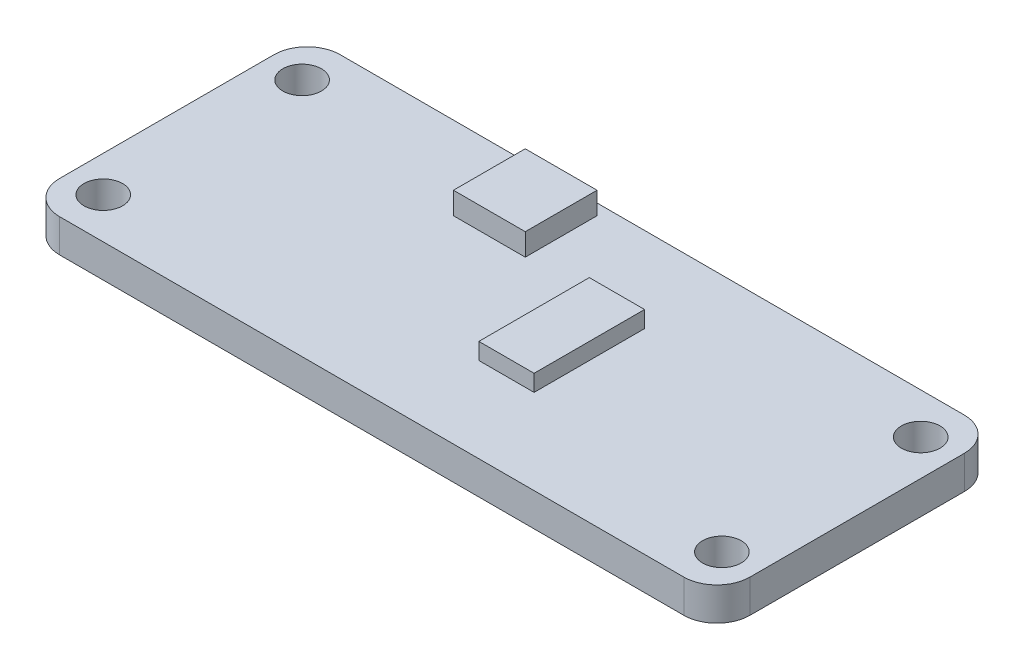
ISO-10303-21;
HEADER;
FILE_DESCRIPTION(('STEP AP214'),'2;1');
FILE_NAME('part.step','',(''),(''),'','','');
FILE_SCHEMA(('AUTOMOTIVE_DESIGN { 1 0 10303 214 1 1 1 1 }'));
ENDSEC;
DATA;
#1=APPLICATION_CONTEXT('core data for automotive mechanical design processes');
#2=APPLICATION_PROTOCOL_DEFINITION('international standard','automotive_design',2000,#1);
#3=PRODUCT_CONTEXT('',#1,'mechanical');
#4=PRODUCT('Part','Part','',(#3));
#5=PRODUCT_RELATED_PRODUCT_CATEGORY('part','',(#4));
#6=PRODUCT_DEFINITION_FORMATION('','',#4);
#7=PRODUCT_DEFINITION_CONTEXT('part definition',#1,'design');
#8=PRODUCT_DEFINITION('design','',#6,#7);
#9=PRODUCT_DEFINITION_SHAPE('','',#8);
#10=(LENGTH_UNIT() NAMED_UNIT(*) SI_UNIT(.MILLI.,.METRE.));
#11=(NAMED_UNIT(*) PLANE_ANGLE_UNIT() SI_UNIT($,.RADIAN.));
#12=(NAMED_UNIT(*) SI_UNIT($,.STERADIAN.) SOLID_ANGLE_UNIT());
#13=UNCERTAINTY_MEASURE_WITH_UNIT(LENGTH_MEASURE(1.E-05),#10,'distance_accuracy_value','');
#14=(GEOMETRIC_REPRESENTATION_CONTEXT(3) GLOBAL_UNCERTAINTY_ASSIGNED_CONTEXT((#13)) GLOBAL_UNIT_ASSIGNED_CONTEXT((#10,
#11,#12)) REPRESENTATION_CONTEXT('',''));
#15=CARTESIAN_POINT('',(0.,0.,0.));
#16=DIRECTION('',(0.,0.,1.));
#17=DIRECTION('',(1.,0.,0.));
#18=AXIS2_PLACEMENT_3D('',#15,#16,#17);
#19=CARTESIAN_POINT('',(0.,3.,0.));
#20=DIRECTION('',(0.,1.,0.));
#21=DIRECTION('',(0.,0.,1.));
#22=AXIS2_PLACEMENT_3D('',#19,#20,#21);
#23=PLANE('',#22);
#24=CARTESIAN_POINT('',(-28.,3.,9.));
#25=DIRECTION('',(0.,1.,0.));
#26=DIRECTION('',(0.,0.,1.));
#27=AXIS2_PLACEMENT_3D('',#24,#25,#26);
#28=CIRCLE('',#27,1.75);
#29=CARTESIAN_POINT('',(-28.,3.,10.75));
#30=VERTEX_POINT('',#29);
#31=EDGE_CURVE('E255',#30,#30,#28,.T.);
#32=ORIENTED_EDGE('',*,*,#31,.F.);
#33=EDGE_LOOP('',(#32));
#34=FACE_BOUND('',#33,.T.);
#35=CARTESIAN_POINT('',(28.,3.,9.));
#36=DIRECTION('',(0.,1.,0.));
#37=DIRECTION('',(0.,0.,1.));
#38=AXIS2_PLACEMENT_3D('',#35,#36,#37);
#39=CIRCLE('',#38,1.75);
#40=CARTESIAN_POINT('',(28.,3.,10.75));
#41=VERTEX_POINT('',#40);
#42=EDGE_CURVE('E247',#41,#41,#39,.T.);
#43=ORIENTED_EDGE('',*,*,#42,.F.);
#44=EDGE_LOOP('',(#43));
#45=FACE_BOUND('',#44,.T.);
#46=CARTESIAN_POINT('',(28.,3.,-9.));
#47=DIRECTION('',(0.,1.,0.));
#48=DIRECTION('',(0.,0.,1.));
#49=AXIS2_PLACEMENT_3D('',#46,#47,#48);
#50=CIRCLE('',#49,1.75);
#51=CARTESIAN_POINT('',(28.,3.,-7.25));
#52=VERTEX_POINT('',#51);
#53=EDGE_CURVE('E238',#52,#52,#50,.T.);
#54=ORIENTED_EDGE('',*,*,#53,.F.);
#55=EDGE_LOOP('',(#54));
#56=FACE_BOUND('',#55,.T.);
#57=CARTESIAN_POINT('',(-28.,3.,-9.));
#58=DIRECTION('',(0.,1.,0.));
#59=DIRECTION('',(0.,0.,1.));
#60=AXIS2_PLACEMENT_3D('',#57,#58,#59);
#61=CIRCLE('',#60,1.75);
#62=CARTESIAN_POINT('',(-28.,3.,-7.25));
#63=VERTEX_POINT('',#62);
#64=EDGE_CURVE('E242',#63,#63,#61,.T.);
#65=ORIENTED_EDGE('',*,*,#64,.F.);
#66=EDGE_LOOP('',(#65));
#67=FACE_BOUND('',#66,.T.);
#68=DIRECTION('',(-1.,0.,0.));
#69=VECTOR('',#68,1.);
#70=CARTESIAN_POINT('',(-31.25,3.,-12.7));
#71=LINE('',#70,#69);
#72=CARTESIAN_POINT('',(28.25,3.,-12.7));
#73=VERTEX_POINT('',#72);
#74=CARTESIAN_POINT('',(-28.25,3.,-12.7));
#75=VERTEX_POINT('',#74);
#76=EDGE_CURVE('E274',#73,#75,#71,.T.);
#77=ORIENTED_EDGE('',*,*,#76,.T.);
#78=CARTESIAN_POINT('',(-28.25,3.,-9.7));
#79=DIRECTION('',(0.,1.,0.));
#80=DIRECTION('',(0.,0.,1.));
#81=AXIS2_PLACEMENT_3D('',#78,#79,#80);
#82=CIRCLE('',#81,3.);
#83=CARTESIAN_POINT('',(-31.25,3.,-9.7));
#84=VERTEX_POINT('',#83);
#85=EDGE_CURVE('E336',#75,#84,#82,.T.);
#86=ORIENTED_EDGE('',*,*,#85,.T.);
#87=DIRECTION('',(0.,0.,1.));
#88=VECTOR('',#87,1.);
#89=CARTESIAN_POINT('',(-31.25,3.,-12.7));
#90=LINE('',#89,#88);
#91=CARTESIAN_POINT('',(-31.25,3.,9.7));
#92=VERTEX_POINT('',#91);
#93=EDGE_CURVE('E279',#84,#92,#90,.T.);
#94=ORIENTED_EDGE('',*,*,#93,.T.);
#95=CARTESIAN_POINT('',(-28.25,3.,9.7));
#96=DIRECTION('',(0.,1.,0.));
#97=DIRECTION('',(0.,0.,1.));
#98=AXIS2_PLACEMENT_3D('',#95,#96,#97);
#99=CIRCLE('',#98,3.);
#100=CARTESIAN_POINT('',(-28.25,3.,12.7));
#101=VERTEX_POINT('',#100);
#102=EDGE_CURVE('E327',#92,#101,#99,.T.);
#103=ORIENTED_EDGE('',*,*,#102,.T.);
#104=DIRECTION('',(1.,0.,0.));
#105=VECTOR('',#104,1.);
#106=CARTESIAN_POINT('',(-31.25,3.,12.7));
#107=LINE('',#106,#105);
#108=CARTESIAN_POINT('',(28.25,3.,12.7));
#109=VERTEX_POINT('',#108);
#110=EDGE_CURVE('E283',#101,#109,#107,.T.);
#111=ORIENTED_EDGE('',*,*,#110,.T.);
#112=CARTESIAN_POINT('',(28.25,3.,9.7));
#113=DIRECTION('',(0.,1.,0.));
#114=DIRECTION('',(0.,0.,1.));
#115=AXIS2_PLACEMENT_3D('',#112,#113,#114);
#116=CIRCLE('',#115,3.);
#117=CARTESIAN_POINT('',(31.25,3.,9.7));
#118=VERTEX_POINT('',#117);
#119=EDGE_CURVE('E330',#109,#118,#116,.T.);
#120=ORIENTED_EDGE('',*,*,#119,.T.);
#121=DIRECTION('',(0.,0.,-1.));
#122=VECTOR('',#121,1.);
#123=CARTESIAN_POINT('',(31.25,3.,-12.7));
#124=LINE('',#123,#122);
#125=CARTESIAN_POINT('',(31.25,3.,-9.7));
#126=VERTEX_POINT('',#125);
#127=EDGE_CURVE('E270',#118,#126,#124,.T.);
#128=ORIENTED_EDGE('',*,*,#127,.T.);
#129=CARTESIAN_POINT('',(28.25,3.,-9.7));
#130=DIRECTION('',(0.,1.,0.));
#131=DIRECTION('',(0.,0.,1.));
#132=AXIS2_PLACEMENT_3D('',#129,#130,#131);
#133=CIRCLE('',#132,3.);
#134=EDGE_CURVE('E333',#126,#73,#133,.T.);
#135=ORIENTED_EDGE('',*,*,#134,.T.);
#136=EDGE_LOOP('',(#77,#86,#94,#103,#111,#120,#128,#135));
#137=FACE_BOUND('',#136,.T.);
#138=DIRECTION('',(-1.,0.,0.));
#139=VECTOR('',#138,1.);
#140=CARTESIAN_POINT('',(-10.5,3.,-11.7));
#141=LINE('',#140,#139);
#142=CARTESIAN_POINT('',(-4.,3.,-11.7));
#143=VERTEX_POINT('',#142);
#144=CARTESIAN_POINT('',(-10.5,3.,-11.7));
#145=VERTEX_POINT('',#144);
#146=EDGE_CURVE('E198',#143,#145,#141,.T.);
#147=ORIENTED_EDGE('',*,*,#146,.F.);
#148=DIRECTION('',(0.,0.,-1.));
#149=VECTOR('',#148,1.);
#150=CARTESIAN_POINT('',(-4.,3.,-11.7));
#151=LINE('',#150,#149);
#152=CARTESIAN_POINT('',(-4.,3.,-5.2));
#153=VERTEX_POINT('',#152);
#154=EDGE_CURVE('E193',#153,#143,#151,.T.);
#155=ORIENTED_EDGE('',*,*,#154,.F.);
#156=DIRECTION('',(1.,0.,0.));
#157=VECTOR('',#156,1.);
#158=CARTESIAN_POINT('',(-10.5,3.,-5.2));
#159=LINE('',#158,#157);
#160=CARTESIAN_POINT('',(-10.5,3.,-5.2));
#161=VERTEX_POINT('',#160);
#162=EDGE_CURVE('E208',#161,#153,#159,.T.);
#163=ORIENTED_EDGE('',*,*,#162,.F.);
#164=DIRECTION('',(0.,0.,1.));
#165=VECTOR('',#164,1.);
#166=CARTESIAN_POINT('',(-10.5,3.,-11.7));
#167=LINE('',#166,#165);
#168=EDGE_CURVE('E220',#145,#161,#167,.T.);
#169=ORIENTED_EDGE('',*,*,#168,.F.);
#170=EDGE_LOOP('',(#147,#155,#163,#169));
#171=FACE_BOUND('',#170,.T.);
#172=DIRECTION('',(-1.,0.,0.));
#173=VECTOR('',#172,1.);
#174=CARTESIAN_POINT('',(2.,3.,-5.));
#175=LINE('',#174,#173);
#176=CARTESIAN_POINT('',(7.,3.,-5.));
#177=VERTEX_POINT('',#176);
#178=CARTESIAN_POINT('',(2.,3.,-5.));
#179=VERTEX_POINT('',#178);
#180=EDGE_CURVE('E653',#177,#179,#175,.T.);
#181=ORIENTED_EDGE('',*,*,#180,.F.);
#182=DIRECTION('',(0.,0.,-1.));
#183=VECTOR('',#182,1.);
#184=CARTESIAN_POINT('',(7.,3.,-5.));
#185=LINE('',#184,#183);
#186=CARTESIAN_POINT('',(7.,3.,5.));
#187=VERTEX_POINT('',#186);
#188=EDGE_CURVE('E190',#187,#177,#185,.T.);
#189=ORIENTED_EDGE('',*,*,#188,.F.);
#190=DIRECTION('',(1.,0.,0.));
#191=VECTOR('',#190,1.);
#192=CARTESIAN_POINT('',(2.,3.,5.));
#193=LINE('',#192,#191);
#194=CARTESIAN_POINT('',(2.,3.,5.));
#195=VERTEX_POINT('',#194);
#196=EDGE_CURVE('E186',#195,#187,#193,.T.);
#197=ORIENTED_EDGE('',*,*,#196,.F.);
#198=DIRECTION('',(0.,0.,1.));
#199=VECTOR('',#198,1.);
#200=CARTESIAN_POINT('',(2.,3.,-5.));
#201=LINE('',#200,#199);
#202=EDGE_CURVE('E649',#179,#195,#201,.T.);
#203=ORIENTED_EDGE('',*,*,#202,.F.);
#204=EDGE_LOOP('',(#181,#189,#197,#203));
#205=FACE_BOUND('',#204,.T.);
#206=ADVANCED_FACE('F51',(#34,#45,#56,#67,#137,#171,#205),#23,.T.);
#207=CARTESIAN_POINT('',(31.25,3.,-12.7));
#208=DIRECTION('',(-1.,0.,0.));
#209=DIRECTION('',(0.,0.,1.));
#210=AXIS2_PLACEMENT_3D('',#207,#208,#209);
#211=PLANE('',#210);
#212=DIRECTION('',(0.,0.,-1.));
#213=VECTOR('',#212,1.);
#214=CARTESIAN_POINT('',(31.25,0.,-12.7));
#215=LINE('',#214,#213);
#216=CARTESIAN_POINT('',(31.25,0.,9.7));
#217=VERTEX_POINT('',#216);
#218=CARTESIAN_POINT('',(31.25,0.,-9.7));
#219=VERTEX_POINT('',#218);
#220=EDGE_CURVE('E266',#217,#219,#215,.T.);
#221=ORIENTED_EDGE('',*,*,#220,.T.);
#222=DIRECTION('',(0.,-1.,0.));
#223=VECTOR('',#222,1.);
#224=CARTESIAN_POINT('',(31.25,3.,-9.7));
#225=LINE('',#224,#223);
#226=EDGE_CURVE('E343',#219,#126,#225,.F.);
#227=ORIENTED_EDGE('',*,*,#226,.T.);
#228=ORIENTED_EDGE('',*,*,#127,.F.);
#229=DIRECTION('',(0.,-1.,0.));
#230=VECTOR('',#229,1.);
#231=CARTESIAN_POINT('',(31.25,3.,9.7));
#232=LINE('',#231,#230);
#233=EDGE_CURVE('E339',#118,#217,#232,.T.);
#234=ORIENTED_EDGE('',*,*,#233,.T.);
#235=EDGE_LOOP('',(#221,#227,#228,#234));
#236=FACE_BOUND('',#235,.T.);
#237=ADVANCED_FACE('F365',(#236),#211,.F.);
#238=CARTESIAN_POINT('',(-31.25,3.,-12.7));
#239=DIRECTION('',(0.,0.,1.));
#240=DIRECTION('',(1.,0.,0.));
#241=AXIS2_PLACEMENT_3D('',#238,#239,#240);
#242=PLANE('',#241);
#243=DIRECTION('',(-1.,0.,0.));
#244=VECTOR('',#243,1.);
#245=CARTESIAN_POINT('',(-31.25,0.,-12.7));
#246=LINE('',#245,#244);
#247=CARTESIAN_POINT('',(28.25,0.,-12.7));
#248=VERTEX_POINT('',#247);
#249=CARTESIAN_POINT('',(-28.25,0.,-12.7));
#250=VERTEX_POINT('',#249);
#251=EDGE_CURVE('E291',#248,#250,#246,.T.);
#252=ORIENTED_EDGE('',*,*,#251,.T.);
#253=DIRECTION('',(0.,-1.,0.));
#254=VECTOR('',#253,1.);
#255=CARTESIAN_POINT('',(-28.25,3.,-12.7));
#256=LINE('',#255,#254);
#257=EDGE_CURVE('E324',#250,#75,#256,.F.);
#258=ORIENTED_EDGE('',*,*,#257,.T.);
#259=ORIENTED_EDGE('',*,*,#76,.F.);
#260=DIRECTION('',(0.,-1.,0.));
#261=VECTOR('',#260,1.);
#262=CARTESIAN_POINT('',(28.25,3.,-12.7));
#263=LINE('',#262,#261);
#264=EDGE_CURVE('E320',#73,#248,#263,.T.);
#265=ORIENTED_EDGE('',*,*,#264,.T.);
#266=EDGE_LOOP('',(#252,#258,#259,#265));
#267=FACE_BOUND('',#266,.T.);
#268=ADVANCED_FACE('F376',(#267),#242,.F.);
#269=CARTESIAN_POINT('',(-31.25,3.,-12.7));
#270=DIRECTION('',(1.,0.,0.));
#271=DIRECTION('',(0.,0.,-1.));
#272=AXIS2_PLACEMENT_3D('',#269,#270,#271);
#273=PLANE('',#272);
#274=ORIENTED_EDGE('',*,*,#93,.F.);
#275=DIRECTION('',(0.,-1.,0.));
#276=VECTOR('',#275,1.);
#277=CARTESIAN_POINT('',(-31.25,3.,-9.7));
#278=LINE('',#277,#276);
#279=CARTESIAN_POINT('',(-31.25,0.,-9.7));
#280=VERTEX_POINT('',#279);
#281=EDGE_CURVE('E304',#84,#280,#278,.T.);
#282=ORIENTED_EDGE('',*,*,#281,.T.);
#283=DIRECTION('',(0.,0.,1.));
#284=VECTOR('',#283,1.);
#285=CARTESIAN_POINT('',(-31.25,0.,-12.7));
#286=LINE('',#285,#284);
#287=CARTESIAN_POINT('',(-31.25,0.,9.7));
#288=VERTEX_POINT('',#287);
#289=EDGE_CURVE('E295',#280,#288,#286,.T.);
#290=ORIENTED_EDGE('',*,*,#289,.T.);
#291=DIRECTION('',(0.,-1.,0.));
#292=VECTOR('',#291,1.);
#293=CARTESIAN_POINT('',(-31.25,3.,9.7));
#294=LINE('',#293,#292);
#295=EDGE_CURVE('E287',#288,#92,#294,.F.);
#296=ORIENTED_EDGE('',*,*,#295,.T.);
#297=EDGE_LOOP('',(#274,#282,#290,#296));
#298=FACE_BOUND('',#297,.T.);
#299=ADVANCED_FACE('F384',(#298),#273,.F.);
#300=CARTESIAN_POINT('',(-31.25,3.,12.7));
#301=DIRECTION('',(0.,0.,-1.));
#302=DIRECTION('',(-1.,0.,0.));
#303=AXIS2_PLACEMENT_3D('',#300,#301,#302);
#304=PLANE('',#303);
#305=DIRECTION('',(1.,0.,0.));
#306=VECTOR('',#305,1.);
#307=CARTESIAN_POINT('',(-31.25,0.,12.7));
#308=LINE('',#307,#306);
#309=CARTESIAN_POINT('',(-28.25,0.,12.7));
#310=VERTEX_POINT('',#309);
#311=CARTESIAN_POINT('',(28.25,0.,12.7));
#312=VERTEX_POINT('',#311);
#313=EDGE_CURVE('E275',#310,#312,#308,.T.);
#314=ORIENTED_EDGE('',*,*,#313,.T.);
#315=DIRECTION('',(0.,-1.,0.));
#316=VECTOR('',#315,1.);
#317=CARTESIAN_POINT('',(28.25,3.,12.7));
#318=LINE('',#317,#316);
#319=EDGE_CURVE('E11',#312,#109,#318,.F.);
#320=ORIENTED_EDGE('',*,*,#319,.T.);
#321=ORIENTED_EDGE('',*,*,#110,.F.);
#322=DIRECTION('',(0.,-1.,0.));
#323=VECTOR('',#322,1.);
#324=CARTESIAN_POINT('',(-28.25,3.,12.7));
#325=LINE('',#324,#323);
#326=EDGE_CURVE('E60',#101,#310,#325,.T.);
#327=ORIENTED_EDGE('',*,*,#326,.T.);
#328=EDGE_LOOP('',(#314,#320,#321,#327));
#329=FACE_BOUND('',#328,.T.);
#330=ADVANCED_FACE('F351',(#329),#304,.F.);
#331=CARTESIAN_POINT('',(0.,0.,0.));
#332=DIRECTION('',(0.,1.,0.));
#333=DIRECTION('',(0.,0.,1.));
#334=AXIS2_PLACEMENT_3D('',#331,#332,#333);
#335=PLANE('',#334);
#336=CARTESIAN_POINT('',(-28.,0.,9.));
#337=DIRECTION('',(0.,1.,0.));
#338=DIRECTION('',(0.,0.,1.));
#339=AXIS2_PLACEMENT_3D('',#336,#337,#338);
#340=CIRCLE('',#339,1.75);
#341=CARTESIAN_POINT('',(-28.,0.,10.75));
#342=VERTEX_POINT('',#341);
#343=EDGE_CURVE('E237',#342,#342,#340,.T.);
#344=ORIENTED_EDGE('',*,*,#343,.T.);
#345=EDGE_LOOP('',(#344));
#346=FACE_BOUND('',#345,.T.);
#347=CARTESIAN_POINT('',(28.,0.,9.));
#348=DIRECTION('',(0.,1.,0.));
#349=DIRECTION('',(0.,0.,1.));
#350=AXIS2_PLACEMENT_3D('',#347,#348,#349);
#351=CIRCLE('',#350,1.75);
#352=CARTESIAN_POINT('',(28.,0.,10.75));
#353=VERTEX_POINT('',#352);
#354=EDGE_CURVE('E251',#353,#353,#351,.T.);
#355=ORIENTED_EDGE('',*,*,#354,.T.);
#356=EDGE_LOOP('',(#355));
#357=FACE_BOUND('',#356,.T.);
#358=CARTESIAN_POINT('',(28.,0.,-9.));
#359=DIRECTION('',(0.,1.,0.));
#360=DIRECTION('',(0.,0.,1.));
#361=AXIS2_PLACEMENT_3D('',#358,#359,#360);
#362=CIRCLE('',#361,1.75);
#363=CARTESIAN_POINT('',(28.,0.,-7.25));
#364=VERTEX_POINT('',#363);
#365=EDGE_CURVE('E243',#364,#364,#362,.T.);
#366=ORIENTED_EDGE('',*,*,#365,.T.);
#367=EDGE_LOOP('',(#366));
#368=FACE_BOUND('',#367,.T.);
#369=CARTESIAN_POINT('',(-28.,0.,-9.));
#370=DIRECTION('',(0.,1.,0.));
#371=DIRECTION('',(0.,0.,1.));
#372=AXIS2_PLACEMENT_3D('',#369,#370,#371);
#373=CIRCLE('',#372,1.75);
#374=CARTESIAN_POINT('',(-28.,0.,-7.25));
#375=VERTEX_POINT('',#374);
#376=EDGE_CURVE('E262',#375,#375,#373,.T.);
#377=ORIENTED_EDGE('',*,*,#376,.T.);
#378=EDGE_LOOP('',(#377));
#379=FACE_BOUND('',#378,.T.);
#380=ORIENTED_EDGE('',*,*,#289,.F.);
#381=CARTESIAN_POINT('',(-28.25,0.,-9.7));
#382=DIRECTION('',(0.,1.,0.));
#383=DIRECTION('',(0.,0.,1.));
#384=AXIS2_PLACEMENT_3D('',#381,#382,#383);
#385=CIRCLE('',#384,3.);
#386=EDGE_CURVE('E317',#280,#250,#385,.F.);
#387=ORIENTED_EDGE('',*,*,#386,.T.);
#388=ORIENTED_EDGE('',*,*,#251,.F.);
#389=CARTESIAN_POINT('',(28.25,0.,-9.7));
#390=DIRECTION('',(0.,1.,0.));
#391=DIRECTION('',(0.,0.,1.));
#392=AXIS2_PLACEMENT_3D('',#389,#390,#391);
#393=CIRCLE('',#392,3.);
#394=EDGE_CURVE('E314',#248,#219,#393,.F.);
#395=ORIENTED_EDGE('',*,*,#394,.T.);
#396=ORIENTED_EDGE('',*,*,#220,.F.);
#397=CARTESIAN_POINT('',(28.25,0.,9.7));
#398=DIRECTION('',(0.,1.,0.));
#399=DIRECTION('',(0.,0.,1.));
#400=AXIS2_PLACEMENT_3D('',#397,#398,#399);
#401=CIRCLE('',#400,3.);
#402=EDGE_CURVE('E311',#217,#312,#401,.F.);
#403=ORIENTED_EDGE('',*,*,#402,.T.);
#404=ORIENTED_EDGE('',*,*,#313,.F.);
#405=CARTESIAN_POINT('',(-28.25,0.,9.7));
#406=DIRECTION('',(0.,1.,0.));
#407=DIRECTION('',(0.,0.,1.));
#408=AXIS2_PLACEMENT_3D('',#405,#406,#407);
#409=CIRCLE('',#408,3.);
#410=EDGE_CURVE('E308',#310,#288,#409,.F.);
#411=ORIENTED_EDGE('',*,*,#410,.T.);
#412=EDGE_LOOP('',(#380,#387,#388,#395,#396,#403,#404,#411));
#413=FACE_BOUND('',#412,.T.);
#414=ADVANCED_FACE('F357',(#346,#357,#368,#379,#413),#335,.F.);
#415=CARTESIAN_POINT('',(-28.25,3.,-9.7));
#416=DIRECTION('',(0.,-1.,0.));
#417=DIRECTION('',(0.,0.,-1.));
#418=AXIS2_PLACEMENT_3D('',#415,#416,#417);
#419=CYLINDRICAL_SURFACE('',#418,3.);
#420=ORIENTED_EDGE('',*,*,#85,.F.);
#421=ORIENTED_EDGE('',*,*,#257,.F.);
#422=ORIENTED_EDGE('',*,*,#386,.F.);
#423=ORIENTED_EDGE('',*,*,#281,.F.);
#424=EDGE_LOOP('',(#420,#421,#422,#423));
#425=FACE_BOUND('',#424,.T.);
#426=ADVANCED_FACE('F381',(#425),#419,.T.);
#427=CARTESIAN_POINT('',(28.25,3.,-9.7));
#428=DIRECTION('',(0.,-1.,0.));
#429=DIRECTION('',(0.,0.,-1.));
#430=AXIS2_PLACEMENT_3D('',#427,#428,#429);
#431=CYLINDRICAL_SURFACE('',#430,3.);
#432=ORIENTED_EDGE('',*,*,#134,.F.);
#433=ORIENTED_EDGE('',*,*,#226,.F.);
#434=ORIENTED_EDGE('',*,*,#394,.F.);
#435=ORIENTED_EDGE('',*,*,#264,.F.);
#436=EDGE_LOOP('',(#432,#433,#434,#435));
#437=FACE_BOUND('',#436,.T.);
#438=ADVANCED_FACE('F373',(#437),#431,.T.);
#439=CARTESIAN_POINT('',(28.25,3.,9.7));
#440=DIRECTION('',(0.,-1.,0.));
#441=DIRECTION('',(0.,0.,-1.));
#442=AXIS2_PLACEMENT_3D('',#439,#440,#441);
#443=CYLINDRICAL_SURFACE('',#442,3.);
#444=ORIENTED_EDGE('',*,*,#119,.F.);
#445=ORIENTED_EDGE('',*,*,#319,.F.);
#446=ORIENTED_EDGE('',*,*,#402,.F.);
#447=ORIENTED_EDGE('',*,*,#233,.F.);
#448=EDGE_LOOP('',(#444,#445,#446,#447));
#449=FACE_BOUND('',#448,.T.);
#450=ADVANCED_FACE('F362',(#449),#443,.T.);
#451=CARTESIAN_POINT('',(-28.25,3.,9.7));
#452=DIRECTION('',(0.,-1.,0.));
#453=DIRECTION('',(0.,0.,-1.));
#454=AXIS2_PLACEMENT_3D('',#451,#452,#453);
#455=CYLINDRICAL_SURFACE('',#454,3.);
#456=ORIENTED_EDGE('',*,*,#102,.F.);
#457=ORIENTED_EDGE('',*,*,#295,.F.);
#458=ORIENTED_EDGE('',*,*,#410,.F.);
#459=ORIENTED_EDGE('',*,*,#326,.F.);
#460=EDGE_LOOP('',(#456,#457,#458,#459));
#461=FACE_BOUND('',#460,.T.);
#462=ADVANCED_FACE('F53',(#461),#455,.T.);
#463=CARTESIAN_POINT('',(-28.,0.,-9.));
#464=DIRECTION('',(0.,1.,0.));
#465=DIRECTION('',(0.,0.,1.));
#466=AXIS2_PLACEMENT_3D('',#463,#464,#465);
#467=CYLINDRICAL_SURFACE('',#466,1.75);
#468=ORIENTED_EDGE('',*,*,#376,.F.);
#469=EDGE_LOOP('',(#468));
#470=FACE_BOUND('',#469,.T.);
#471=ORIENTED_EDGE('',*,*,#64,.T.);
#472=EDGE_LOOP('',(#471));
#473=FACE_BOUND('',#472,.T.);
#474=ADVANCED_FACE('F387',(#470,#473),#467,.F.);
#475=CARTESIAN_POINT('',(28.,0.,-9.));
#476=DIRECTION('',(0.,1.,0.));
#477=DIRECTION('',(0.,0.,1.));
#478=AXIS2_PLACEMENT_3D('',#475,#476,#477);
#479=CYLINDRICAL_SURFACE('',#478,1.75);
#480=ORIENTED_EDGE('',*,*,#365,.F.);
#481=EDGE_LOOP('',(#480));
#482=FACE_BOUND('',#481,.T.);
#483=ORIENTED_EDGE('',*,*,#53,.T.);
#484=EDGE_LOOP('',(#483));
#485=FACE_BOUND('',#484,.T.);
#486=ADVANCED_FACE('F393',(#482,#485),#479,.F.);
#487=CARTESIAN_POINT('',(28.,0.,9.));
#488=DIRECTION('',(0.,1.,0.));
#489=DIRECTION('',(0.,0.,1.));
#490=AXIS2_PLACEMENT_3D('',#487,#488,#489);
#491=CYLINDRICAL_SURFACE('',#490,1.75);
#492=ORIENTED_EDGE('',*,*,#354,.F.);
#493=EDGE_LOOP('',(#492));
#494=FACE_BOUND('',#493,.T.);
#495=ORIENTED_EDGE('',*,*,#42,.T.);
#496=EDGE_LOOP('',(#495));
#497=FACE_BOUND('',#496,.T.);
#498=ADVANCED_FACE('F449',(#494,#497),#491,.F.);
#499=CARTESIAN_POINT('',(-28.,0.,9.));
#500=DIRECTION('',(0.,1.,0.));
#501=DIRECTION('',(0.,0.,1.));
#502=AXIS2_PLACEMENT_3D('',#499,#500,#501);
#503=CYLINDRICAL_SURFACE('',#502,1.75);
#504=ORIENTED_EDGE('',*,*,#343,.F.);
#505=EDGE_LOOP('',(#504));
#506=FACE_BOUND('',#505,.T.);
#507=ORIENTED_EDGE('',*,*,#31,.T.);
#508=EDGE_LOOP('',(#507));
#509=FACE_BOUND('',#508,.T.);
#510=ADVANCED_FACE('F459',(#506,#509),#503,.F.);
#511=CARTESIAN_POINT('',(-4.,5.,-11.7));
#512=DIRECTION('',(-1.,0.,0.));
#513=DIRECTION('',(0.,0.,1.));
#514=AXIS2_PLACEMENT_3D('',#511,#512,#513);
#515=PLANE('',#514);
#516=ORIENTED_EDGE('',*,*,#154,.T.);
#517=DIRECTION('',(0.,-1.,0.));
#518=VECTOR('',#517,1.);
#519=CARTESIAN_POINT('',(-4.,5.,-11.7));
#520=LINE('',#519,#518);
#521=CARTESIAN_POINT('',(-4.,5.,-11.7));
#522=VERTEX_POINT('',#521);
#523=EDGE_CURVE('E234',#522,#143,#520,.T.);
#524=ORIENTED_EDGE('',*,*,#523,.F.);
#525=DIRECTION('',(0.,0.,-1.));
#526=VECTOR('',#525,1.);
#527=CARTESIAN_POINT('',(-4.,5.,-11.7));
#528=LINE('',#527,#526);
#529=CARTESIAN_POINT('',(-4.,5.,-5.2));
#530=VERTEX_POINT('',#529);
#531=EDGE_CURVE('E203',#530,#522,#528,.T.);
#532=ORIENTED_EDGE('',*,*,#531,.F.);
#533=DIRECTION('',(0.,-1.,0.));
#534=VECTOR('',#533,1.);
#535=CARTESIAN_POINT('',(-4.,5.,-5.2));
#536=LINE('',#535,#534);
#537=EDGE_CURVE('E216',#530,#153,#536,.T.);
#538=ORIENTED_EDGE('',*,*,#537,.T.);
#539=EDGE_LOOP('',(#516,#524,#532,#538));
#540=FACE_BOUND('',#539,.T.);
#541=ADVANCED_FACE('F469',(#540),#515,.F.);
#542=CARTESIAN_POINT('',(-10.5,5.,-11.7));
#543=DIRECTION('',(0.,0.,1.));
#544=DIRECTION('',(1.,0.,0.));
#545=AXIS2_PLACEMENT_3D('',#542,#543,#544);
#546=PLANE('',#545);
#547=ORIENTED_EDGE('',*,*,#146,.T.);
#548=DIRECTION('',(0.,-1.,0.));
#549=VECTOR('',#548,1.);
#550=CARTESIAN_POINT('',(-10.5,5.,-11.7));
#551=LINE('',#550,#549);
#552=CARTESIAN_POINT('',(-10.5,5.,-11.7));
#553=VERTEX_POINT('',#552);
#554=EDGE_CURVE('E230',#553,#145,#551,.T.);
#555=ORIENTED_EDGE('',*,*,#554,.F.);
#556=DIRECTION('',(-1.,0.,0.));
#557=VECTOR('',#556,1.);
#558=CARTESIAN_POINT('',(-10.5,5.,-11.7));
#559=LINE('',#558,#557);
#560=EDGE_CURVE('E207',#522,#553,#559,.T.);
#561=ORIENTED_EDGE('',*,*,#560,.F.);
#562=ORIENTED_EDGE('',*,*,#523,.T.);
#563=EDGE_LOOP('',(#547,#555,#561,#562));
#564=FACE_BOUND('',#563,.T.);
#565=ADVANCED_FACE('F479',(#564),#546,.F.);
#566=CARTESIAN_POINT('',(-10.5,5.,-11.7));
#567=DIRECTION('',(1.,0.,0.));
#568=DIRECTION('',(0.,0.,-1.));
#569=AXIS2_PLACEMENT_3D('',#566,#567,#568);
#570=PLANE('',#569);
#571=ORIENTED_EDGE('',*,*,#168,.T.);
#572=DIRECTION('',(0.,-1.,0.));
#573=VECTOR('',#572,1.);
#574=CARTESIAN_POINT('',(-10.5,5.,-5.2));
#575=LINE('',#574,#573);
#576=CARTESIAN_POINT('',(-10.5,5.,-5.2));
#577=VERTEX_POINT('',#576);
#578=EDGE_CURVE('E75',#577,#161,#575,.T.);
#579=ORIENTED_EDGE('',*,*,#578,.F.);
#580=DIRECTION('',(0.,0.,1.));
#581=VECTOR('',#580,1.);
#582=CARTESIAN_POINT('',(-10.5,5.,-11.7));
#583=LINE('',#582,#581);
#584=EDGE_CURVE('E211',#553,#577,#583,.T.);
#585=ORIENTED_EDGE('',*,*,#584,.F.);
#586=ORIENTED_EDGE('',*,*,#554,.T.);
#587=EDGE_LOOP('',(#571,#579,#585,#586));
#588=FACE_BOUND('',#587,.T.);
#589=ADVANCED_FACE('F491',(#588),#570,.F.);
#590=CARTESIAN_POINT('',(-10.5,5.,-5.2));
#591=DIRECTION('',(0.,0.,-1.));
#592=DIRECTION('',(-1.,0.,0.));
#593=AXIS2_PLACEMENT_3D('',#590,#591,#592);
#594=PLANE('',#593);
#595=ORIENTED_EDGE('',*,*,#162,.T.);
#596=ORIENTED_EDGE('',*,*,#537,.F.);
#597=DIRECTION('',(1.,0.,0.));
#598=VECTOR('',#597,1.);
#599=CARTESIAN_POINT('',(-10.5,5.,-5.2));
#600=LINE('',#599,#598);
#601=EDGE_CURVE('E214',#577,#530,#600,.T.);
#602=ORIENTED_EDGE('',*,*,#601,.F.);
#603=ORIENTED_EDGE('',*,*,#578,.T.);
#604=EDGE_LOOP('',(#595,#596,#602,#603));
#605=FACE_BOUND('',#604,.T.);
#606=ADVANCED_FACE('F503',(#605),#594,.F.);
#607=CARTESIAN_POINT('',(0.,5.,0.));
#608=DIRECTION('',(0.,1.,0.));
#609=DIRECTION('',(0.,0.,1.));
#610=AXIS2_PLACEMENT_3D('',#607,#608,#609);
#611=PLANE('',#610);
#612=ORIENTED_EDGE('',*,*,#531,.T.);
#613=ORIENTED_EDGE('',*,*,#560,.T.);
#614=ORIENTED_EDGE('',*,*,#584,.T.);
#615=ORIENTED_EDGE('',*,*,#601,.T.);
#616=EDGE_LOOP('',(#612,#613,#614,#615));
#617=FACE_BOUND('',#616,.T.);
#618=ADVANCED_FACE('F515',(#617),#611,.T.);
#619=CARTESIAN_POINT('',(7.,4.5,-5.));
#620=DIRECTION('',(-1.,0.,0.));
#621=DIRECTION('',(0.,0.,1.));
#622=AXIS2_PLACEMENT_3D('',#619,#620,#621);
#623=PLANE('',#622);
#624=ORIENTED_EDGE('',*,*,#188,.T.);
#625=DIRECTION('',(0.,-1.,0.));
#626=VECTOR('',#625,1.);
#627=CARTESIAN_POINT('',(7.,4.5,-5.));
#628=LINE('',#627,#626);
#629=CARTESIAN_POINT('',(7.,4.5,-5.));
#630=VERTEX_POINT('',#629);
#631=EDGE_CURVE('E169',#630,#177,#628,.T.);
#632=ORIENTED_EDGE('',*,*,#631,.F.);
#633=DIRECTION('',(0.,0.,-1.));
#634=VECTOR('',#633,1.);
#635=CARTESIAN_POINT('',(7.,4.5,-5.));
#636=LINE('',#635,#634);
#637=CARTESIAN_POINT('',(7.,4.5,5.));
#638=VERTEX_POINT('',#637);
#639=EDGE_CURVE('E177',#638,#630,#636,.T.);
#640=ORIENTED_EDGE('',*,*,#639,.F.);
#641=DIRECTION('',(0.,-1.,0.));
#642=VECTOR('',#641,1.);
#643=CARTESIAN_POINT('',(7.,4.5,5.));
#644=LINE('',#643,#642);
#645=EDGE_CURVE('E645',#638,#187,#644,.T.);
#646=ORIENTED_EDGE('',*,*,#645,.T.);
#647=EDGE_LOOP('',(#624,#632,#640,#646));
#648=FACE_BOUND('',#647,.T.);
#649=ADVANCED_FACE('F188',(#648),#623,.F.);
#650=CARTESIAN_POINT('',(2.,4.5,-5.));
#651=DIRECTION('',(0.,0.,1.));
#652=DIRECTION('',(1.,0.,0.));
#653=AXIS2_PLACEMENT_3D('',#650,#651,#652);
#654=PLANE('',#653);
#655=ORIENTED_EDGE('',*,*,#180,.T.);
#656=DIRECTION('',(0.,-1.,0.));
#657=VECTOR('',#656,1.);
#658=CARTESIAN_POINT('',(2.,4.5,-5.));
#659=LINE('',#658,#657);
#660=CARTESIAN_POINT('',(2.,4.5,-5.));
#661=VERTEX_POINT('',#660);
#662=EDGE_CURVE('E172',#661,#179,#659,.T.);
#663=ORIENTED_EDGE('',*,*,#662,.F.);
#664=DIRECTION('',(-1.,0.,0.));
#665=VECTOR('',#664,1.);
#666=CARTESIAN_POINT('',(2.,4.5,-5.));
#667=LINE('',#666,#665);
#668=EDGE_CURVE('E165',#630,#661,#667,.T.);
#669=ORIENTED_EDGE('',*,*,#668,.F.);
#670=ORIENTED_EDGE('',*,*,#631,.T.);
#671=EDGE_LOOP('',(#655,#663,#669,#670));
#672=FACE_BOUND('',#671,.T.);
#673=ADVANCED_FACE('F167',(#672),#654,.F.);
#674=CARTESIAN_POINT('',(2.,4.5,-5.));
#675=DIRECTION('',(1.,0.,0.));
#676=DIRECTION('',(0.,0.,-1.));
#677=AXIS2_PLACEMENT_3D('',#674,#675,#676);
#678=PLANE('',#677);
#679=ORIENTED_EDGE('',*,*,#202,.T.);
#680=DIRECTION('',(0.,-1.,0.));
#681=VECTOR('',#680,1.);
#682=CARTESIAN_POINT('',(2.,4.5,5.));
#683=LINE('',#682,#681);
#684=CARTESIAN_POINT('',(2.,4.5,5.));
#685=VERTEX_POINT('',#684);
#686=EDGE_CURVE('E67',#685,#195,#683,.T.);
#687=ORIENTED_EDGE('',*,*,#686,.F.);
#688=DIRECTION('',(0.,0.,1.));
#689=VECTOR('',#688,1.);
#690=CARTESIAN_POINT('',(2.,4.5,-5.));
#691=LINE('',#690,#689);
#692=EDGE_CURVE('E176',#661,#685,#691,.T.);
#693=ORIENTED_EDGE('',*,*,#692,.F.);
#694=ORIENTED_EDGE('',*,*,#662,.T.);
#695=EDGE_LOOP('',(#679,#687,#693,#694));
#696=FACE_BOUND('',#695,.T.);
#697=ADVANCED_FACE('F549',(#696),#678,.F.);
#698=CARTESIAN_POINT('',(2.,4.5,5.));
#699=DIRECTION('',(0.,0.,-1.));
#700=DIRECTION('',(-1.,0.,0.));
#701=AXIS2_PLACEMENT_3D('',#698,#699,#700);
#702=PLANE('',#701);
#703=ORIENTED_EDGE('',*,*,#196,.T.);
#704=ORIENTED_EDGE('',*,*,#645,.F.);
#705=DIRECTION('',(1.,0.,0.));
#706=VECTOR('',#705,1.);
#707=CARTESIAN_POINT('',(2.,4.5,5.));
#708=LINE('',#707,#706);
#709=EDGE_CURVE('E181',#685,#638,#708,.T.);
#710=ORIENTED_EDGE('',*,*,#709,.F.);
#711=ORIENTED_EDGE('',*,*,#686,.T.);
#712=EDGE_LOOP('',(#703,#704,#710,#711));
#713=FACE_BOUND('',#712,.T.);
#714=ADVANCED_FACE('F560',(#713),#702,.F.);
#715=CARTESIAN_POINT('',(0.,4.5,0.));
#716=DIRECTION('',(0.,1.,0.));
#717=DIRECTION('',(0.,0.,1.));
#718=AXIS2_PLACEMENT_3D('',#715,#716,#717);
#719=PLANE('',#718);
#720=ORIENTED_EDGE('',*,*,#639,.T.);
#721=ORIENTED_EDGE('',*,*,#668,.T.);
#722=ORIENTED_EDGE('',*,*,#692,.T.);
#723=ORIENTED_EDGE('',*,*,#709,.T.);
#724=EDGE_LOOP('',(#720,#721,#722,#723));
#725=FACE_BOUND('',#724,.T.);
#726=ADVANCED_FACE('F180',(#725),#719,.T.);
#727=CLOSED_SHELL('',(#206,#237,#268,#299,#330,#414,#426,#438,#450,#462,#474,#486,#498,#510,
#541,#565,#589,#606,#618,#649,#673,#697,#714,#726));
#728=MANIFOLD_SOLID_BREP('B2',#727);
#729=ADVANCED_BREP_SHAPE_REPRESENTATION('',(#18,#728),#14);
#730=SHAPE_DEFINITION_REPRESENTATION(#9,#729);
ENDSEC;
END-ISO-10303-21;
